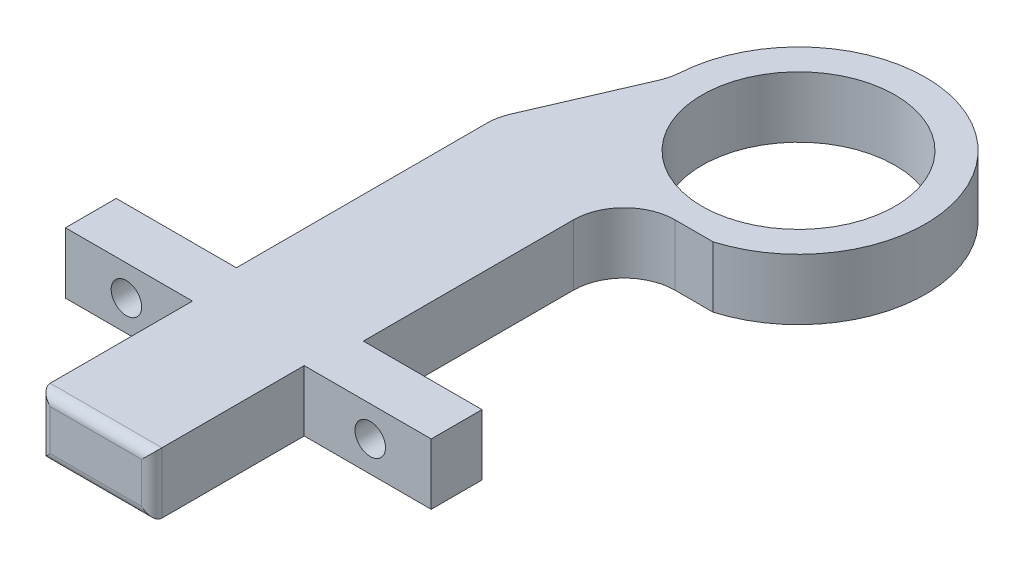
ISO-10303-21;
HEADER;
FILE_DESCRIPTION(('STEP AP214'),'2;1');
FILE_NAME('part.step','',(''),(''),'','','');
FILE_SCHEMA(('AUTOMOTIVE_DESIGN { 1 0 10303 214 1 1 1 1 }'));
ENDSEC;
DATA;
#1=APPLICATION_CONTEXT('core data for automotive mechanical design processes');
#2=APPLICATION_PROTOCOL_DEFINITION('international standard','automotive_design',2000,#1);
#3=PRODUCT_CONTEXT('',#1,'mechanical');
#4=PRODUCT('Part','Part','',(#3));
#5=PRODUCT_RELATED_PRODUCT_CATEGORY('part','',(#4));
#6=PRODUCT_DEFINITION_FORMATION('','',#4);
#7=PRODUCT_DEFINITION_CONTEXT('part definition',#1,'design');
#8=PRODUCT_DEFINITION('design','',#6,#7);
#9=PRODUCT_DEFINITION_SHAPE('','',#8);
#10=(LENGTH_UNIT() NAMED_UNIT(*) SI_UNIT(.MILLI.,.METRE.));
#11=(NAMED_UNIT(*) PLANE_ANGLE_UNIT() SI_UNIT($,.RADIAN.));
#12=(NAMED_UNIT(*) SI_UNIT($,.STERADIAN.) SOLID_ANGLE_UNIT());
#13=UNCERTAINTY_MEASURE_WITH_UNIT(LENGTH_MEASURE(1.E-05),#10,'distance_accuracy_value','');
#14=(GEOMETRIC_REPRESENTATION_CONTEXT(3) GLOBAL_UNCERTAINTY_ASSIGNED_CONTEXT((#13)) GLOBAL_UNIT_ASSIGNED_CONTEXT((#10,
#11,#12)) REPRESENTATION_CONTEXT('',''));
#15=CARTESIAN_POINT('',(0.,0.,0.));
#16=DIRECTION('',(0.,0.,1.));
#17=DIRECTION('',(1.,0.,0.));
#18=AXIS2_PLACEMENT_3D('',#15,#16,#17);
#19=CARTESIAN_POINT('',(0.,6.,16.));
#20=DIRECTION('',(0.,0.,1.));
#21=DIRECTION('',(1.,0.,0.));
#22=AXIS2_PLACEMENT_3D('',#19,#20,#21);
#23=PLANE('',#22);
#24=CARTESIAN_POINT('',(-12.,3.,16.));
#25=DIRECTION('',(0.,0.,1.));
#26=DIRECTION('',(1.,0.,0.));
#27=AXIS2_PLACEMENT_3D('',#24,#25,#26);
#28=CIRCLE('',#27,1.5);
#29=CARTESIAN_POINT('',(-10.5,3.,16.));
#30=VERTEX_POINT('',#29);
#31=EDGE_CURVE('E232',#30,#30,#28,.T.);
#32=ORIENTED_EDGE('',*,*,#31,.T.);
#33=EDGE_LOOP('',(#32));
#34=FACE_BOUND('',#33,.T.);
#35=DIRECTION('',(-1.,0.,0.));
#36=VECTOR('',#35,1.);
#37=CARTESIAN_POINT('',(0.,0.,16.));
#38=LINE('',#37,#36);
#39=CARTESIAN_POINT('',(-6.,0.,16.));
#40=VERTEX_POINT('',#39);
#41=CARTESIAN_POINT('',(-17.6776695296638,0.,16.));
#42=VERTEX_POINT('',#41);
#43=EDGE_CURVE('E192',#40,#42,#38,.T.);
#44=ORIENTED_EDGE('',*,*,#43,.T.);
#45=DIRECTION('',(0.,-1.,0.));
#46=VECTOR('',#45,1.);
#47=CARTESIAN_POINT('',(-17.6776695296638,6.,16.));
#48=LINE('',#47,#46);
#49=CARTESIAN_POINT('',(-17.6776695296638,6.,16.));
#50=VERTEX_POINT('',#49);
#51=EDGE_CURVE('E173',#50,#42,#48,.T.);
#52=ORIENTED_EDGE('',*,*,#51,.F.);
#53=DIRECTION('',(-1.,0.,0.));
#54=VECTOR('',#53,1.);
#55=CARTESIAN_POINT('',(0.,6.,16.));
#56=LINE('',#55,#54);
#57=CARTESIAN_POINT('',(-6.,6.,16.));
#58=VERTEX_POINT('',#57);
#59=EDGE_CURVE('E179',#58,#50,#56,.T.);
#60=ORIENTED_EDGE('',*,*,#59,.F.);
#61=DIRECTION('',(0.,-1.,0.));
#62=VECTOR('',#61,1.);
#63=CARTESIAN_POINT('',(-6.,6.,16.));
#64=LINE('',#63,#62);
#65=EDGE_CURVE('E270',#58,#40,#64,.T.);
#66=ORIENTED_EDGE('',*,*,#65,.T.);
#67=EDGE_LOOP('',(#44,#52,#60,#66));
#68=FACE_BOUND('',#67,.T.);
#69=ADVANCED_FACE('F35',(#34,#68),#23,.F.);
#70=CARTESIAN_POINT('',(-17.6776695296638,6.,0.));
#71=DIRECTION('',(-1.,0.,0.));
#72=DIRECTION('',(0.,0.,1.));
#73=AXIS2_PLACEMENT_3D('',#70,#71,#72);
#74=PLANE('',#73);
#75=DIRECTION('',(0.,0.,-1.));
#76=VECTOR('',#75,1.);
#77=CARTESIAN_POINT('',(-17.6776695296638,0.,0.));
#78=LINE('',#77,#76);
#79=CARTESIAN_POINT('',(-17.6776695296638,0.,-4.67169950086209));
#80=VERTEX_POINT('',#79);
#81=EDGE_CURVE('E272',#42,#80,#78,.T.);
#82=ORIENTED_EDGE('',*,*,#81,.T.);
#83=DIRECTION('',(0.,-1.,0.));
#84=VECTOR('',#83,1.);
#85=CARTESIAN_POINT('',(-17.6776695296638,6.,-4.67169950086209));
#86=LINE('',#85,#84);
#87=CARTESIAN_POINT('',(-17.6776695296638,6.,-4.67169950086209));
#88=VERTEX_POINT('',#87);
#89=EDGE_CURVE('E176',#88,#80,#86,.T.);
#90=ORIENTED_EDGE('',*,*,#89,.F.);
#91=DIRECTION('',(0.,0.,-1.));
#92=VECTOR('',#91,1.);
#93=CARTESIAN_POINT('',(-17.6776695296638,6.,0.));
#94=LINE('',#93,#92);
#95=EDGE_CURVE('E169',#50,#88,#94,.T.);
#96=ORIENTED_EDGE('',*,*,#95,.F.);
#97=ORIENTED_EDGE('',*,*,#51,.T.);
#98=EDGE_LOOP('',(#82,#90,#96,#97));
#99=FACE_BOUND('',#98,.T.);
#100=ADVANCED_FACE('F171',(#99),#74,.F.);
#101=CARTESIAN_POINT('',(-12.6776695296638,6.,-4.67169950086212));
#102=DIRECTION('',(0.,-1.,0.));
#103=DIRECTION('',(0.,0.,-1.));
#104=AXIS2_PLACEMENT_3D('',#101,#102,#103);
#105=CYLINDRICAL_SURFACE('',#104,5.);
#106=CARTESIAN_POINT('',(-12.6776695296638,0.,-4.67169950086212));
#107=DIRECTION('',(0.,1.,0.));
#108=DIRECTION('',(0.,0.,1.));
#109=AXIS2_PLACEMENT_3D('',#106,#107,#108);
#110=CIRCLE('',#109,5.);
#111=CARTESIAN_POINT('',(-12.6776695296638,0.,-9.67169950086212));
#112=VERTEX_POINT('',#111);
#113=EDGE_CURVE('E275',#80,#112,#110,.F.);
#114=ORIENTED_EDGE('',*,*,#113,.T.);
#115=DIRECTION('',(0.,-1.,0.));
#116=VECTOR('',#115,1.);
#117=CARTESIAN_POINT('',(-12.6776695296638,6.,-9.67169950086212));
#118=LINE('',#117,#116);
#119=CARTESIAN_POINT('',(-12.6776695296638,6.,-9.67169950086212));
#120=VERTEX_POINT('',#119);
#121=EDGE_CURVE('E197',#120,#112,#118,.T.);
#122=ORIENTED_EDGE('',*,*,#121,.F.);
#123=CARTESIAN_POINT('',(-12.6776695296638,6.,-4.67169950086212));
#124=DIRECTION('',(0.,1.,0.));
#125=DIRECTION('',(0.,0.,1.));
#126=AXIS2_PLACEMENT_3D('',#123,#124,#125);
#127=CIRCLE('',#126,5.);
#128=EDGE_CURVE('E178',#88,#120,#127,.F.);
#129=ORIENTED_EDGE('',*,*,#128,.F.);
#130=ORIENTED_EDGE('',*,*,#89,.T.);
#131=EDGE_LOOP('',(#114,#122,#129,#130));
#132=FACE_BOUND('',#131,.T.);
#133=ADVANCED_FACE('F343',(#132),#105,.F.);
#134=CARTESIAN_POINT('',(0.,6.,-9.67169950086212));
#135=DIRECTION('',(0.,0.,1.));
#136=DIRECTION('',(1.,0.,0.));
#137=AXIS2_PLACEMENT_3D('',#134,#135,#136);
#138=PLANE('',#137);
#139=DIRECTION('',(-1.,0.,0.));
#140=VECTOR('',#139,1.);
#141=CARTESIAN_POINT('',(0.,0.,-9.67169950086212));
#142=LINE('',#141,#140);
#143=CARTESIAN_POINT('',(-8.92857142857138,0.,-9.67169950086212));
#144=VERTEX_POINT('',#143);
#145=EDGE_CURVE('E278',#144,#112,#142,.T.);
#146=ORIENTED_EDGE('',*,*,#145,.F.);
#147=DIRECTION('',(0.,-1.,0.));
#148=VECTOR('',#147,1.);
#149=CARTESIAN_POINT('',(-8.92857142857138,6.,-9.67169950086212));
#150=LINE('',#149,#148);
#151=CARTESIAN_POINT('',(-8.92857142857138,6.,-9.67169950086212));
#152=VERTEX_POINT('',#151);
#153=EDGE_CURVE('E335',#152,#144,#150,.T.);
#154=ORIENTED_EDGE('',*,*,#153,.F.);
#155=DIRECTION('',(-1.,0.,0.));
#156=VECTOR('',#155,1.);
#157=CARTESIAN_POINT('',(0.,6.,-9.67169950086212));
#158=LINE('',#157,#156);
#159=EDGE_CURVE('E241',#152,#120,#158,.T.);
#160=ORIENTED_EDGE('',*,*,#159,.T.);
#161=ORIENTED_EDGE('',*,*,#121,.T.);
#162=EDGE_LOOP('',(#146,#154,#160,#161));
#163=FACE_BOUND('',#162,.T.);
#164=ADVANCED_FACE('F339',(#163),#138,.T.);
#165=CARTESIAN_POINT('',(-12.5,6.,-21.650635094611));
#166=DIRECTION('',(0.,-1.,0.));
#167=DIRECTION('',(0.,0.,-1.));
#168=AXIS2_PLACEMENT_3D('',#165,#166,#167);
#169=CYLINDRICAL_SURFACE('',#168,12.5);
#170=CARTESIAN_POINT('',(-12.5,0.,-21.650635094611));
#171=DIRECTION('',(0.,1.,0.));
#172=DIRECTION('',(0.,0.,1.));
#173=AXIS2_PLACEMENT_3D('',#170,#171,#172);
#174=CIRCLE('',#173,12.5);
#175=CARTESIAN_POINT('',(-24.9745166094324,0.,-22.4484040843536));
#176=VERTEX_POINT('',#175);
#177=EDGE_CURVE('E281',#144,#176,#174,.T.);
#178=ORIENTED_EDGE('',*,*,#177,.T.);
#179=DIRECTION('',(0.,-1.,0.));
#180=VECTOR('',#179,1.);
#181=CARTESIAN_POINT('',(-24.9745166094324,6.,-22.4484040843536));
#182=LINE('',#181,#180);
#183=CARTESIAN_POINT('',(-24.9745166094324,6.,-22.4484040843536));
#184=VERTEX_POINT('',#183);
#185=EDGE_CURVE('E332',#184,#176,#182,.T.);
#186=ORIENTED_EDGE('',*,*,#185,.F.);
#187=CARTESIAN_POINT('',(-12.5,6.,-21.650635094611));
#188=DIRECTION('',(0.,1.,0.));
#189=DIRECTION('',(0.,0.,1.));
#190=AXIS2_PLACEMENT_3D('',#187,#188,#189);
#191=CIRCLE('',#190,12.5);
#192=EDGE_CURVE('E244',#152,#184,#191,.T.);
#193=ORIENTED_EDGE('',*,*,#192,.F.);
#194=ORIENTED_EDGE('',*,*,#153,.T.);
#195=EDGE_LOOP('',(#178,#186,#193,#194));
#196=FACE_BOUND('',#195,.T.);
#197=ADVANCED_FACE('F351',(#196),#169,.T.);
#198=CARTESIAN_POINT('',(-29.9643232532053,6.,-22.7675116802506));
#199=DIRECTION('',(0.,-1.,0.));
#200=DIRECTION('',(0.,0.,-1.));
#201=AXIS2_PLACEMENT_3D('',#198,#199,#200);
#202=CYLINDRICAL_SURFACE('',#201,5.);
#203=CARTESIAN_POINT('',(-29.9643232532053,0.,-22.7675116802506));
#204=DIRECTION('',(0.,1.,0.));
#205=DIRECTION('',(0.,0.,1.));
#206=AXIS2_PLACEMENT_3D('',#203,#204,#205);
#207=CIRCLE('',#206,5.);
#208=CARTESIAN_POINT('',(-25.3747016471425,0.,-20.7837340936344));
#209=VERTEX_POINT('',#208);
#210=EDGE_CURVE('E283',#176,#209,#207,.F.);
#211=ORIENTED_EDGE('',*,*,#210,.T.);
#212=DIRECTION('',(0.,-1.,0.));
#213=VECTOR('',#212,1.);
#214=CARTESIAN_POINT('',(-25.3747016471425,6.,-20.7837340936344));
#215=LINE('',#214,#213);
#216=CARTESIAN_POINT('',(-25.3747016471425,6.,-20.7837340936344));
#217=VERTEX_POINT('',#216);
#218=EDGE_CURVE('E330',#217,#209,#215,.T.);
#219=ORIENTED_EDGE('',*,*,#218,.F.);
#220=CARTESIAN_POINT('',(-29.9643232532053,6.,-22.7675116802506));
#221=DIRECTION('',(0.,1.,0.));
#222=DIRECTION('',(0.,0.,1.));
#223=AXIS2_PLACEMENT_3D('',#220,#221,#222);
#224=CIRCLE('',#223,5.);
#225=EDGE_CURVE('E246',#184,#217,#224,.F.);
#226=ORIENTED_EDGE('',*,*,#225,.F.);
#227=ORIENTED_EDGE('',*,*,#185,.T.);
#228=EDGE_LOOP('',(#211,#219,#226,#227));
#229=FACE_BOUND('',#228,.T.);
#230=ADVANCED_FACE('F355',(#229),#202,.F.);
#231=CARTESIAN_POINT('',(-28.9496046006768,6.,-12.5129219089349));
#232=DIRECTION('',(-0.917924321212573,0.,-0.396755517323247));
#233=DIRECTION('',(-0.396755517323247,0.,0.917924321212573));
#234=AXIS2_PLACEMENT_3D('',#231,#232,#233);
#235=PLANE('',#234);
#236=DIRECTION('',(0.396755517323247,0.,-0.917924321212573));
#237=VECTOR('',#236,1.);
#238=CARTESIAN_POINT('',(-28.9496046006768,0.,-12.5129219089349));
#239=LINE('',#238,#237);
#240=CARTESIAN_POINT('',(-29.7672911357266,0.,-10.6211413920209));
#241=VERTEX_POINT('',#240);
#242=EDGE_CURVE('E286',#241,#209,#239,.T.);
#243=ORIENTED_EDGE('',*,*,#242,.F.);
#244=DIRECTION('',(0.,-1.,0.));
#245=VECTOR('',#244,1.);
#246=CARTESIAN_POINT('',(-29.7672911357266,6.,-10.6211413920209));
#247=LINE('',#246,#245);
#248=CARTESIAN_POINT('',(-29.7672911357266,6.,-10.6211413920209));
#249=VERTEX_POINT('',#248);
#250=EDGE_CURVE('E328',#249,#241,#247,.T.);
#251=ORIENTED_EDGE('',*,*,#250,.F.);
#252=DIRECTION('',(0.396755517323247,0.,-0.917924321212573));
#253=VECTOR('',#252,1.);
#254=CARTESIAN_POINT('',(-28.9496046006768,6.,-12.5129219089349));
#255=LINE('',#254,#253);
#256=EDGE_CURVE('E248',#249,#217,#255,.T.);
#257=ORIENTED_EDGE('',*,*,#256,.T.);
#258=ORIENTED_EDGE('',*,*,#218,.T.);
#259=EDGE_LOOP('',(#243,#251,#257,#258));
#260=FACE_BOUND('',#259,.T.);
#261=ADVANCED_FACE('F515',(#260),#235,.T.);
#262=CARTESIAN_POINT('',(-25.1776695296638,6.,-8.63736380540464));
#263=DIRECTION('',(0.,-1.,0.));
#264=DIRECTION('',(0.,0.,-1.));
#265=AXIS2_PLACEMENT_3D('',#262,#263,#264);
#266=CYLINDRICAL_SURFACE('',#265,5.);
#267=CARTESIAN_POINT('',(-25.1776695296638,0.,-8.63736380540464));
#268=DIRECTION('',(0.,1.,0.));
#269=DIRECTION('',(0.,0.,1.));
#270=AXIS2_PLACEMENT_3D('',#267,#268,#269);
#271=CIRCLE('',#270,5.);
#272=CARTESIAN_POINT('',(-30.1776695296638,0.,-8.63736380540462));
#273=VERTEX_POINT('',#272);
#274=EDGE_CURVE('E289',#273,#241,#271,.F.);
#275=ORIENTED_EDGE('',*,*,#274,.F.);
#276=DIRECTION('',(0.,-1.,0.));
#277=VECTOR('',#276,1.);
#278=CARTESIAN_POINT('',(-30.1776695296638,6.,-8.63736380540462));
#279=LINE('',#278,#277);
#280=CARTESIAN_POINT('',(-30.1776695296638,6.,-8.63736380540462));
#281=VERTEX_POINT('',#280);
#282=EDGE_CURVE('E326',#281,#273,#279,.T.);
#283=ORIENTED_EDGE('',*,*,#282,.F.);
#284=CARTESIAN_POINT('',(-25.1776695296638,6.,-8.63736380540464));
#285=DIRECTION('',(0.,1.,0.));
#286=DIRECTION('',(0.,0.,1.));
#287=AXIS2_PLACEMENT_3D('',#284,#285,#286);
#288=CIRCLE('',#287,5.);
#289=EDGE_CURVE('E251',#281,#249,#288,.F.);
#290=ORIENTED_EDGE('',*,*,#289,.T.);
#291=ORIENTED_EDGE('',*,*,#250,.T.);
#292=EDGE_LOOP('',(#275,#283,#290,#291));
#293=FACE_BOUND('',#292,.T.);
#294=ADVANCED_FACE('F363',(#293),#266,.T.);
#295=CARTESIAN_POINT('',(-30.1776695296638,6.,0.));
#296=DIRECTION('',(-1.,0.,0.));
#297=DIRECTION('',(0.,0.,1.));
#298=AXIS2_PLACEMENT_3D('',#295,#296,#297);
#299=PLANE('',#298);
#300=DIRECTION('',(0.,0.,-1.));
#301=VECTOR('',#300,1.);
#302=CARTESIAN_POINT('',(-30.1776695296638,0.,0.));
#303=LINE('',#302,#301);
#304=CARTESIAN_POINT('',(-30.1776695296638,0.,16.));
#305=VERTEX_POINT('',#304);
#306=EDGE_CURVE('E292',#305,#273,#303,.T.);
#307=ORIENTED_EDGE('',*,*,#306,.F.);
#308=DIRECTION('',(0.,-1.,0.));
#309=VECTOR('',#308,1.);
#310=CARTESIAN_POINT('',(-30.1776695296638,6.,16.));
#311=LINE('',#310,#309);
#312=CARTESIAN_POINT('',(-30.1776695296638,6.,16.));
#313=VERTEX_POINT('',#312);
#314=EDGE_CURVE('E324',#313,#305,#311,.T.);
#315=ORIENTED_EDGE('',*,*,#314,.F.);
#316=DIRECTION('',(0.,0.,-1.));
#317=VECTOR('',#316,1.);
#318=CARTESIAN_POINT('',(-30.1776695296638,6.,0.));
#319=LINE('',#318,#317);
#320=EDGE_CURVE('E254',#313,#281,#319,.T.);
#321=ORIENTED_EDGE('',*,*,#320,.T.);
#322=ORIENTED_EDGE('',*,*,#282,.T.);
#323=EDGE_LOOP('',(#307,#315,#321,#322));
#324=FACE_BOUND('',#323,.T.);
#325=ADVANCED_FACE('F367',(#324),#299,.T.);
#326=CARTESIAN_POINT('',(-36.,3.,16.));
#327=DIRECTION('',(0.,0.,1.));
#328=DIRECTION('',(1.,0.,0.));
#329=AXIS2_PLACEMENT_3D('',#326,#327,#328);
#330=CIRCLE('',#329,1.5);
#331=CARTESIAN_POINT('',(-34.5,3.,16.));
#332=VERTEX_POINT('',#331);
#333=EDGE_CURVE('E237',#332,#332,#330,.T.);
#334=ORIENTED_EDGE('',*,*,#333,.T.);
#335=EDGE_LOOP('',(#334));
#336=FACE_BOUND('',#335,.T.);
#337=CARTESIAN_POINT('',(-42.,0.,16.));
#338=VERTEX_POINT('',#337);
#339=EDGE_CURVE('E273',#305,#338,#38,.T.);
#340=ORIENTED_EDGE('',*,*,#339,.T.);
#341=DIRECTION('',(0.,-1.,0.));
#342=VECTOR('',#341,1.);
#343=CARTESIAN_POINT('',(-42.,6.,16.));
#344=LINE('',#343,#342);
#345=CARTESIAN_POINT('',(-42.,6.,16.));
#346=VERTEX_POINT('',#345);
#347=EDGE_CURVE('E321',#346,#338,#344,.T.);
#348=ORIENTED_EDGE('',*,*,#347,.F.);
#349=EDGE_CURVE('E190',#313,#346,#56,.T.);
#350=ORIENTED_EDGE('',*,*,#349,.F.);
#351=ORIENTED_EDGE('',*,*,#314,.T.);
#352=EDGE_LOOP('',(#340,#348,#350,#351));
#353=FACE_BOUND('',#352,.T.);
#354=ADVANCED_FACE('F373',(#336,#353),#23,.F.);
#355=CARTESIAN_POINT('',(-42.,6.,0.));
#356=DIRECTION('',(1.,0.,0.));
#357=DIRECTION('',(0.,0.,-1.));
#358=AXIS2_PLACEMENT_3D('',#355,#356,#357);
#359=PLANE('',#358);
#360=DIRECTION('',(0.,0.,1.));
#361=VECTOR('',#360,1.);
#362=CARTESIAN_POINT('',(-42.,0.,0.));
#363=LINE('',#362,#361);
#364=CARTESIAN_POINT('',(-42.,0.,21.));
#365=VERTEX_POINT('',#364);
#366=EDGE_CURVE('E295',#338,#365,#363,.T.);
#367=ORIENTED_EDGE('',*,*,#366,.T.);
#368=DIRECTION('',(0.,-1.,0.));
#369=VECTOR('',#368,1.);
#370=CARTESIAN_POINT('',(-42.,6.,21.));
#371=LINE('',#370,#369);
#372=CARTESIAN_POINT('',(-42.,6.,21.));
#373=VERTEX_POINT('',#372);
#374=EDGE_CURVE('E318',#373,#365,#371,.T.);
#375=ORIENTED_EDGE('',*,*,#374,.F.);
#376=DIRECTION('',(0.,0.,1.));
#377=VECTOR('',#376,1.);
#378=CARTESIAN_POINT('',(-42.,6.,0.));
#379=LINE('',#378,#377);
#380=EDGE_CURVE('E257',#346,#373,#379,.T.);
#381=ORIENTED_EDGE('',*,*,#380,.F.);
#382=ORIENTED_EDGE('',*,*,#347,.T.);
#383=EDGE_LOOP('',(#367,#375,#381,#382));
#384=FACE_BOUND('',#383,.T.);
#385=ADVANCED_FACE('F377',(#384),#359,.F.);
#386=CARTESIAN_POINT('',(0.,6.,21.));
#387=DIRECTION('',(0.,0.,-1.));
#388=DIRECTION('',(-1.,0.,0.));
#389=AXIS2_PLACEMENT_3D('',#386,#387,#388);
#390=PLANE('',#389);
#391=CARTESIAN_POINT('',(-36.,3.,21.));
#392=DIRECTION('',(0.,0.,1.));
#393=DIRECTION('',(1.,0.,0.));
#394=AXIS2_PLACEMENT_3D('',#391,#392,#393);
#395=CIRCLE('',#394,1.5);
#396=CARTESIAN_POINT('',(-34.5,3.,21.));
#397=VERTEX_POINT('',#396);
#398=EDGE_CURVE('E227',#397,#397,#395,.T.);
#399=ORIENTED_EDGE('',*,*,#398,.F.);
#400=EDGE_LOOP('',(#399));
#401=FACE_BOUND('',#400,.T.);
#402=DIRECTION('',(1.,0.,0.));
#403=VECTOR('',#402,1.);
#404=CARTESIAN_POINT('',(0.,0.,21.));
#405=LINE('',#404,#403);
#406=CARTESIAN_POINT('',(-29.5,0.,21.));
#407=VERTEX_POINT('',#406);
#408=EDGE_CURVE('E297',#365,#407,#405,.T.);
#409=ORIENTED_EDGE('',*,*,#408,.T.);
#410=DIRECTION('',(0.,-1.,0.));
#411=VECTOR('',#410,1.);
#412=CARTESIAN_POINT('',(-29.5,6.,21.));
#413=LINE('',#412,#411);
#414=CARTESIAN_POINT('',(-29.5,6.,21.));
#415=VERTEX_POINT('',#414);
#416=EDGE_CURVE('E315',#415,#407,#413,.T.);
#417=ORIENTED_EDGE('',*,*,#416,.F.);
#418=DIRECTION('',(1.,0.,0.));
#419=VECTOR('',#418,1.);
#420=CARTESIAN_POINT('',(0.,6.,21.));
#421=LINE('',#420,#419);
#422=EDGE_CURVE('E259',#373,#415,#421,.T.);
#423=ORIENTED_EDGE('',*,*,#422,.F.);
#424=ORIENTED_EDGE('',*,*,#374,.T.);
#425=EDGE_LOOP('',(#409,#417,#423,#424));
#426=FACE_BOUND('',#425,.T.);
#427=ADVANCED_FACE('F382',(#401,#426),#390,.F.);
#428=CARTESIAN_POINT('',(-29.5,6.,0.));
#429=DIRECTION('',(1.,0.,0.));
#430=DIRECTION('',(0.,0.,-1.));
#431=AXIS2_PLACEMENT_3D('',#428,#429,#430);
#432=PLANE('',#431);
#433=DIRECTION('',(0.,0.,1.));
#434=VECTOR('',#433,1.);
#435=CARTESIAN_POINT('',(-29.5,0.,0.));
#436=LINE('',#435,#434);
#437=CARTESIAN_POINT('',(-29.5,0.,35.));
#438=VERTEX_POINT('',#437);
#439=EDGE_CURVE('E299',#407,#438,#436,.T.);
#440=ORIENTED_EDGE('',*,*,#439,.T.);
#441=DIRECTION('',(0.,-1.,0.));
#442=VECTOR('',#441,1.);
#443=CARTESIAN_POINT('',(-29.5,6.,35.));
#444=LINE('',#443,#442);
#445=CARTESIAN_POINT('',(-29.5,6.,35.));
#446=VERTEX_POINT('',#445);
#447=EDGE_CURVE('E207',#438,#446,#444,.F.);
#448=ORIENTED_EDGE('',*,*,#447,.T.);
#449=DIRECTION('',(0.,0.,1.));
#450=VECTOR('',#449,1.);
#451=CARTESIAN_POINT('',(-29.5,6.,0.));
#452=LINE('',#451,#450);
#453=EDGE_CURVE('E261',#415,#446,#452,.T.);
#454=ORIENTED_EDGE('',*,*,#453,.F.);
#455=ORIENTED_EDGE('',*,*,#416,.T.);
#456=EDGE_LOOP('',(#440,#448,#454,#455));
#457=FACE_BOUND('',#456,.T.);
#458=ADVANCED_FACE('F385',(#457),#432,.F.);
#459=CARTESIAN_POINT('',(0.,6.,36.));
#460=DIRECTION('',(0.,0.,-1.));
#461=DIRECTION('',(-1.,0.,0.));
#462=AXIS2_PLACEMENT_3D('',#459,#460,#461);
#463=PLANE('',#462);
#464=DIRECTION('',(1.,0.,0.));
#465=VECTOR('',#464,1.);
#466=CARTESIAN_POINT('',(-29.5,5.,36.));
#467=LINE('',#466,#465);
#468=CARTESIAN_POINT('',(-19.5,5.,36.));
#469=VERTEX_POINT('',#468);
#470=CARTESIAN_POINT('',(-28.5,5.,36.));
#471=VERTEX_POINT('',#470);
#472=EDGE_CURVE('E202',#469,#471,#467,.F.);
#473=ORIENTED_EDGE('',*,*,#472,.T.);
#474=DIRECTION('',(0.,-1.,0.));
#475=VECTOR('',#474,1.);
#476=CARTESIAN_POINT('',(-28.5,6.,36.));
#477=LINE('',#476,#475);
#478=CARTESIAN_POINT('',(-28.5,1.,36.));
#479=VERTEX_POINT('',#478);
#480=EDGE_CURVE('E204',#471,#479,#477,.T.);
#481=ORIENTED_EDGE('',*,*,#480,.T.);
#482=DIRECTION('',(1.,0.,0.));
#483=VECTOR('',#482,1.);
#484=CARTESIAN_POINT('',(0.,1.,36.));
#485=LINE('',#484,#483);
#486=CARTESIAN_POINT('',(-19.5,1.,36.));
#487=VERTEX_POINT('',#486);
#488=EDGE_CURVE('E193',#479,#487,#485,.T.);
#489=ORIENTED_EDGE('',*,*,#488,.T.);
#490=DIRECTION('',(0.,-1.,0.));
#491=VECTOR('',#490,1.);
#492=CARTESIAN_POINT('',(-19.5,6.,36.));
#493=LINE('',#492,#491);
#494=EDGE_CURVE('E195',#487,#469,#493,.F.);
#495=ORIENTED_EDGE('',*,*,#494,.T.);
#496=EDGE_LOOP('',(#473,#481,#489,#495));
#497=FACE_BOUND('',#496,.T.);
#498=ADVANCED_FACE('F396',(#497),#463,.F.);
#499=CARTESIAN_POINT('',(-18.5,6.,0.));
#500=DIRECTION('',(1.,0.,0.));
#501=DIRECTION('',(0.,0.,-1.));
#502=AXIS2_PLACEMENT_3D('',#499,#500,#501);
#503=PLANE('',#502);
#504=DIRECTION('',(0.,0.,1.));
#505=VECTOR('',#504,1.);
#506=CARTESIAN_POINT('',(-18.5,6.,0.));
#507=LINE('',#506,#505);
#508=CARTESIAN_POINT('',(-18.5,6.,21.));
#509=VERTEX_POINT('',#508);
#510=CARTESIAN_POINT('',(-18.5,6.,35.));
#511=VERTEX_POINT('',#510);
#512=EDGE_CURVE('E264',#509,#511,#507,.T.);
#513=ORIENTED_EDGE('',*,*,#512,.T.);
#514=DIRECTION('',(0.,-1.,0.));
#515=VECTOR('',#514,1.);
#516=CARTESIAN_POINT('',(-18.5,0.,35.));
#517=LINE('',#516,#515);
#518=CARTESIAN_POINT('',(-18.5,0.,35.));
#519=VERTEX_POINT('',#518);
#520=EDGE_CURVE('E44',#511,#519,#517,.T.);
#521=ORIENTED_EDGE('',*,*,#520,.T.);
#522=DIRECTION('',(0.,0.,1.));
#523=VECTOR('',#522,1.);
#524=CARTESIAN_POINT('',(-18.5,0.,0.));
#525=LINE('',#524,#523);
#526=CARTESIAN_POINT('',(-18.5,0.,21.));
#527=VERTEX_POINT('',#526);
#528=EDGE_CURVE('E303',#527,#519,#525,.T.);
#529=ORIENTED_EDGE('',*,*,#528,.F.);
#530=DIRECTION('',(0.,-1.,0.));
#531=VECTOR('',#530,1.);
#532=CARTESIAN_POINT('',(-18.5,6.,21.));
#533=LINE('',#532,#531);
#534=EDGE_CURVE('E313',#509,#527,#533,.T.);
#535=ORIENTED_EDGE('',*,*,#534,.F.);
#536=EDGE_LOOP('',(#513,#521,#529,#535));
#537=FACE_BOUND('',#536,.T.);
#538=ADVANCED_FACE('F447',(#537),#503,.T.);
#539=CARTESIAN_POINT('',(-12.,3.,21.));
#540=DIRECTION('',(0.,0.,1.));
#541=DIRECTION('',(1.,0.,0.));
#542=AXIS2_PLACEMENT_3D('',#539,#540,#541);
#543=CIRCLE('',#542,1.5);
#544=CARTESIAN_POINT('',(-10.5,3.,21.));
#545=VERTEX_POINT('',#544);
#546=EDGE_CURVE('E222',#545,#545,#543,.T.);
#547=ORIENTED_EDGE('',*,*,#546,.F.);
#548=EDGE_LOOP('',(#547));
#549=FACE_BOUND('',#548,.T.);
#550=CARTESIAN_POINT('',(-6.,0.,21.));
#551=VERTEX_POINT('',#550);
#552=EDGE_CURVE('E300',#527,#551,#405,.T.);
#553=ORIENTED_EDGE('',*,*,#552,.T.);
#554=DIRECTION('',(0.,-1.,0.));
#555=VECTOR('',#554,1.);
#556=CARTESIAN_POINT('',(-6.,6.,21.));
#557=LINE('',#556,#555);
#558=CARTESIAN_POINT('',(-6.,6.,21.));
#559=VERTEX_POINT('',#558);
#560=EDGE_CURVE('E311',#559,#551,#557,.T.);
#561=ORIENTED_EDGE('',*,*,#560,.F.);
#562=EDGE_CURVE('E262',#509,#559,#421,.T.);
#563=ORIENTED_EDGE('',*,*,#562,.F.);
#564=ORIENTED_EDGE('',*,*,#534,.T.);
#565=EDGE_LOOP('',(#553,#561,#563,#564));
#566=FACE_BOUND('',#565,.T.);
#567=ADVANCED_FACE('F443',(#549,#566),#390,.F.);
#568=CARTESIAN_POINT('',(-6.,6.,0.));
#569=DIRECTION('',(1.,0.,0.));
#570=DIRECTION('',(0.,0.,-1.));
#571=AXIS2_PLACEMENT_3D('',#568,#569,#570);
#572=PLANE('',#571);
#573=DIRECTION('',(0.,0.,1.));
#574=VECTOR('',#573,1.);
#575=CARTESIAN_POINT('',(-6.,0.,0.));
#576=LINE('',#575,#574);
#577=EDGE_CURVE('E305',#40,#551,#576,.T.);
#578=ORIENTED_EDGE('',*,*,#577,.F.);
#579=ORIENTED_EDGE('',*,*,#65,.F.);
#580=DIRECTION('',(0.,0.,1.));
#581=VECTOR('',#580,1.);
#582=CARTESIAN_POINT('',(-6.,6.,0.));
#583=LINE('',#582,#581);
#584=EDGE_CURVE('E186',#58,#559,#583,.T.);
#585=ORIENTED_EDGE('',*,*,#584,.T.);
#586=ORIENTED_EDGE('',*,*,#560,.T.);
#587=EDGE_LOOP('',(#578,#579,#585,#586));
#588=FACE_BOUND('',#587,.T.);
#589=ADVANCED_FACE('F439',(#588),#572,.T.);
#590=CARTESIAN_POINT('',(-12.5,6.,-21.650635094611));
#591=DIRECTION('',(0.,-1.,0.));
#592=DIRECTION('',(0.,0.,-1.));
#593=AXIS2_PLACEMENT_3D('',#590,#591,#592);
#594=CYLINDRICAL_SURFACE('',#593,9.5);
#595=CARTESIAN_POINT('',(-12.5,6.,-21.650635094611));
#596=DIRECTION('',(0.,1.,0.));
#597=DIRECTION('',(0.,0.,1.));
#598=AXIS2_PLACEMENT_3D('',#595,#596,#597);
#599=CIRCLE('',#598,9.5);
#600=CARTESIAN_POINT('',(-12.5,6.,-12.150635094611));
#601=VERTEX_POINT('',#600);
#602=EDGE_CURVE('E267',#601,#601,#599,.T.);
#603=ORIENTED_EDGE('',*,*,#602,.T.);
#604=EDGE_LOOP('',(#603));
#605=FACE_BOUND('',#604,.T.);
#606=CARTESIAN_POINT('',(-12.5,0.,-21.650635094611));
#607=DIRECTION('',(0.,1.,0.));
#608=DIRECTION('',(0.,0.,1.));
#609=AXIS2_PLACEMENT_3D('',#606,#607,#608);
#610=CIRCLE('',#609,9.5);
#611=CARTESIAN_POINT('',(-12.5,0.,-12.150635094611));
#612=VERTEX_POINT('',#611);
#613=EDGE_CURVE('E188',#612,#612,#610,.T.);
#614=ORIENTED_EDGE('',*,*,#613,.F.);
#615=EDGE_LOOP('',(#614));
#616=FACE_BOUND('',#615,.T.);
#617=ADVANCED_FACE('F434',(#605,#616),#594,.F.);
#618=CARTESIAN_POINT('',(0.,6.,0.));
#619=DIRECTION('',(0.,1.,0.));
#620=DIRECTION('',(0.,0.,1.));
#621=AXIS2_PLACEMENT_3D('',#618,#619,#620);
#622=PLANE('',#621);
#623=ORIENTED_EDGE('',*,*,#453,.T.);
#624=DIRECTION('',(1.,0.,0.));
#625=VECTOR('',#624,1.);
#626=CARTESIAN_POINT('',(-18.5,6.,35.));
#627=LINE('',#626,#625);
#628=EDGE_CURVE('E59',#446,#511,#627,.T.);
#629=ORIENTED_EDGE('',*,*,#628,.T.);
#630=ORIENTED_EDGE('',*,*,#512,.F.);
#631=ORIENTED_EDGE('',*,*,#562,.T.);
#632=ORIENTED_EDGE('',*,*,#584,.F.);
#633=ORIENTED_EDGE('',*,*,#59,.T.);
#634=ORIENTED_EDGE('',*,*,#95,.T.);
#635=ORIENTED_EDGE('',*,*,#128,.T.);
#636=ORIENTED_EDGE('',*,*,#159,.F.);
#637=ORIENTED_EDGE('',*,*,#192,.T.);
#638=ORIENTED_EDGE('',*,*,#225,.T.);
#639=ORIENTED_EDGE('',*,*,#256,.F.);
#640=ORIENTED_EDGE('',*,*,#289,.F.);
#641=ORIENTED_EDGE('',*,*,#320,.F.);
#642=ORIENTED_EDGE('',*,*,#349,.T.);
#643=ORIENTED_EDGE('',*,*,#380,.T.);
#644=ORIENTED_EDGE('',*,*,#422,.T.);
#645=EDGE_LOOP('',(#623,#629,#630,#631,#632,#633,#634,#635,#636,#637,#638,#639,#640,#641,#642,
#643,#644));
#646=FACE_BOUND('',#645,.T.);
#647=ORIENTED_EDGE('',*,*,#602,.F.);
#648=EDGE_LOOP('',(#647));
#649=FACE_BOUND('',#648,.T.);
#650=ADVANCED_FACE('F183',(#646,#649),#622,.T.);
#651=CARTESIAN_POINT('',(0.,0.,0.));
#652=DIRECTION('',(0.,1.,0.));
#653=DIRECTION('',(0.,0.,1.));
#654=AXIS2_PLACEMENT_3D('',#651,#652,#653);
#655=PLANE('',#654);
#656=ORIENTED_EDGE('',*,*,#528,.T.);
#657=DIRECTION('',(1.,0.,0.));
#658=VECTOR('',#657,1.);
#659=CARTESIAN_POINT('',(0.,0.,35.));
#660=LINE('',#659,#658);
#661=EDGE_CURVE('E11',#519,#438,#660,.F.);
#662=ORIENTED_EDGE('',*,*,#661,.T.);
#663=ORIENTED_EDGE('',*,*,#439,.F.);
#664=ORIENTED_EDGE('',*,*,#408,.F.);
#665=ORIENTED_EDGE('',*,*,#366,.F.);
#666=ORIENTED_EDGE('',*,*,#339,.F.);
#667=ORIENTED_EDGE('',*,*,#306,.T.);
#668=ORIENTED_EDGE('',*,*,#274,.T.);
#669=ORIENTED_EDGE('',*,*,#242,.T.);
#670=ORIENTED_EDGE('',*,*,#210,.F.);
#671=ORIENTED_EDGE('',*,*,#177,.F.);
#672=ORIENTED_EDGE('',*,*,#145,.T.);
#673=ORIENTED_EDGE('',*,*,#113,.F.);
#674=ORIENTED_EDGE('',*,*,#81,.F.);
#675=ORIENTED_EDGE('',*,*,#43,.F.);
#676=ORIENTED_EDGE('',*,*,#577,.T.);
#677=ORIENTED_EDGE('',*,*,#552,.F.);
#678=EDGE_LOOP('',(#656,#662,#663,#664,#665,#666,#667,#668,#669,#670,#671,#672,#673,#674,#675,
#676,#677));
#679=FACE_BOUND('',#678,.T.);
#680=ORIENTED_EDGE('',*,*,#613,.T.);
#681=EDGE_LOOP('',(#680));
#682=FACE_BOUND('',#681,.T.);
#683=ADVANCED_FACE('F346',(#679,#682),#655,.F.);
#684=CARTESIAN_POINT('',(-12.,3.,15.));
#685=DIRECTION('',(0.,0.,1.));
#686=DIRECTION('',(1.,0.,0.));
#687=AXIS2_PLACEMENT_3D('',#684,#685,#686);
#688=CYLINDRICAL_SURFACE('',#687,1.5);
#689=ORIENTED_EDGE('',*,*,#546,.T.);
#690=EDGE_LOOP('',(#689));
#691=FACE_BOUND('',#690,.T.);
#692=ORIENTED_EDGE('',*,*,#31,.F.);
#693=EDGE_LOOP('',(#692));
#694=FACE_BOUND('',#693,.T.);
#695=ADVANCED_FACE('F424',(#691,#694),#688,.F.);
#696=CARTESIAN_POINT('',(-36.,3.,15.));
#697=DIRECTION('',(0.,0.,1.));
#698=DIRECTION('',(1.,0.,0.));
#699=AXIS2_PLACEMENT_3D('',#696,#697,#698);
#700=CYLINDRICAL_SURFACE('',#699,1.5);
#701=ORIENTED_EDGE('',*,*,#398,.T.);
#702=EDGE_LOOP('',(#701));
#703=FACE_BOUND('',#702,.T.);
#704=ORIENTED_EDGE('',*,*,#333,.F.);
#705=EDGE_LOOP('',(#704));
#706=FACE_BOUND('',#705,.T.);
#707=ADVANCED_FACE('F404',(#703,#706),#700,.F.);
#708=CARTESIAN_POINT('',(-19.5,6.,35.));
#709=DIRECTION('',(0.,1.,0.));
#710=DIRECTION('',(0.,0.,1.));
#711=AXIS2_PLACEMENT_3D('',#708,#709,#710);
#712=CYLINDRICAL_SURFACE('',#711,1.);
#713=CARTESIAN_POINT('',(-19.5,1.,35.));
#714=DIRECTION('',(0.707106781186547,0.707106781186547,0.));
#715=DIRECTION('',(0.707106781186547,-0.707106781186547,0.));
#716=AXIS2_PLACEMENT_3D('',#713,#714,#715);
#717=ELLIPSE('',#716,1.41421356237309,1.);
#718=EDGE_CURVE('E215',#519,#487,#717,.F.);
#719=ORIENTED_EDGE('',*,*,#718,.F.);
#720=ORIENTED_EDGE('',*,*,#520,.F.);
#721=CARTESIAN_POINT('',(-19.5,5.,35.));
#722=DIRECTION('',(-0.707106781186547,0.707106781186547,0.));
#723=DIRECTION('',(0.707106781186547,0.707106781186547,0.));
#724=AXIS2_PLACEMENT_3D('',#721,#722,#723);
#725=ELLIPSE('',#724,1.41421356237309,1.);
#726=EDGE_CURVE('E39',#469,#511,#725,.T.);
#727=ORIENTED_EDGE('',*,*,#726,.F.);
#728=ORIENTED_EDGE('',*,*,#494,.F.);
#729=EDGE_LOOP('',(#719,#720,#727,#728));
#730=FACE_BOUND('',#729,.T.);
#731=ADVANCED_FACE('F37',(#730),#712,.T.);
#732=CARTESIAN_POINT('',(0.,5.,35.));
#733=DIRECTION('',(-1.,0.,0.));
#734=DIRECTION('',(0.,0.,1.));
#735=AXIS2_PLACEMENT_3D('',#732,#733,#734);
#736=CYLINDRICAL_SURFACE('',#735,1.);
#737=ORIENTED_EDGE('',*,*,#726,.T.);
#738=ORIENTED_EDGE('',*,*,#628,.F.);
#739=CARTESIAN_POINT('',(-28.5,5.,35.));
#740=DIRECTION('',(-0.707106781186547,-0.707106781186547,0.));
#741=DIRECTION('',(-0.707106781186547,0.707106781186547,0.));
#742=AXIS2_PLACEMENT_3D('',#739,#740,#741);
#743=ELLIPSE('',#742,1.41421356237309,1.);
#744=EDGE_CURVE('E214',#471,#446,#743,.T.);
#745=ORIENTED_EDGE('',*,*,#744,.F.);
#746=ORIENTED_EDGE('',*,*,#472,.F.);
#747=EDGE_LOOP('',(#737,#738,#745,#746));
#748=FACE_BOUND('',#747,.T.);
#749=ADVANCED_FACE('F397',(#748),#736,.T.);
#750=CARTESIAN_POINT('',(0.,1.,35.));
#751=DIRECTION('',(1.,0.,0.));
#752=DIRECTION('',(0.,0.,-1.));
#753=AXIS2_PLACEMENT_3D('',#750,#751,#752);
#754=CYLINDRICAL_SURFACE('',#753,1.);
#755=ORIENTED_EDGE('',*,*,#718,.T.);
#756=ORIENTED_EDGE('',*,*,#488,.F.);
#757=CARTESIAN_POINT('',(-28.5,1.,35.));
#758=DIRECTION('',(0.707106781186547,-0.707106781186547,0.));
#759=DIRECTION('',(0.707106781186547,0.707106781186547,0.));
#760=AXIS2_PLACEMENT_3D('',#757,#758,#759);
#761=ELLIPSE('',#760,1.41421356237309,1.);
#762=EDGE_CURVE('E212',#438,#479,#761,.F.);
#763=ORIENTED_EDGE('',*,*,#762,.F.);
#764=ORIENTED_EDGE('',*,*,#661,.F.);
#765=EDGE_LOOP('',(#755,#756,#763,#764));
#766=FACE_BOUND('',#765,.T.);
#767=ADVANCED_FACE('F393',(#766),#754,.T.);
#768=CARTESIAN_POINT('',(-28.5,6.,35.));
#769=DIRECTION('',(0.,-1.,0.));
#770=DIRECTION('',(0.,0.,-1.));
#771=AXIS2_PLACEMENT_3D('',#768,#769,#770);
#772=CYLINDRICAL_SURFACE('',#771,1.);
#773=ORIENTED_EDGE('',*,*,#744,.T.);
#774=ORIENTED_EDGE('',*,*,#447,.F.);
#775=ORIENTED_EDGE('',*,*,#762,.T.);
#776=ORIENTED_EDGE('',*,*,#480,.F.);
#777=EDGE_LOOP('',(#773,#774,#775,#776));
#778=FACE_BOUND('',#777,.T.);
#779=ADVANCED_FACE('F390',(#778),#772,.T.);
#780=CLOSED_SHELL('',(#69,#100,#133,#164,#197,#230,#261,#294,#325,#354,#385,#427,#458,#498,#538,
#567,#589,#617,#650,#683,#695,#707,#731,#749,#767,#779));
#781=MANIFOLD_SOLID_BREP('B2',#780);
#782=ADVANCED_BREP_SHAPE_REPRESENTATION('',(#18,#781),#14);
#783=SHAPE_DEFINITION_REPRESENTATION(#9,#782);
ENDSEC;
END-ISO-10303-21;
